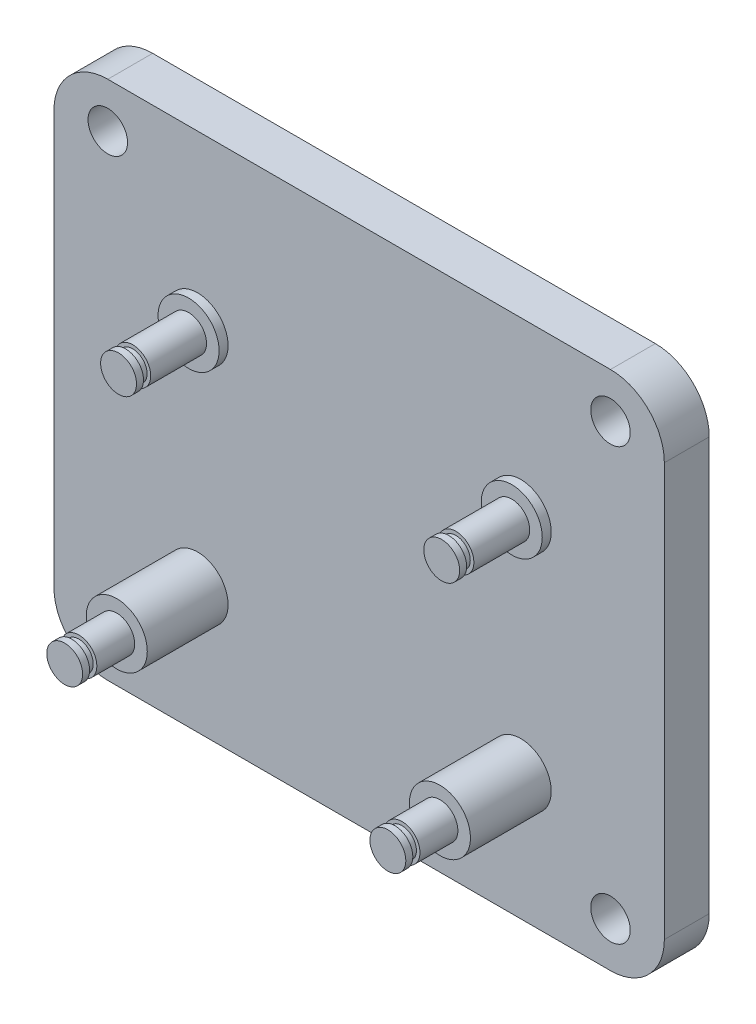
ISO-10303-21;
HEADER;
FILE_DESCRIPTION(('STEP AP214'),'2;1');
FILE_NAME('part.step','',(''),(''),'','','');
FILE_SCHEMA(('AUTOMOTIVE_DESIGN { 1 0 10303 214 1 1 1 1 }'));
ENDSEC;
DATA;
#1=APPLICATION_CONTEXT('core data for automotive mechanical design processes');
#2=APPLICATION_PROTOCOL_DEFINITION('international standard','automotive_design',2000,#1);
#3=PRODUCT_CONTEXT('',#1,'mechanical');
#4=PRODUCT('Part','Part','',(#3));
#5=PRODUCT_RELATED_PRODUCT_CATEGORY('part','',(#4));
#6=PRODUCT_DEFINITION_FORMATION('','',#4);
#7=PRODUCT_DEFINITION_CONTEXT('part definition',#1,'design');
#8=PRODUCT_DEFINITION('design','',#6,#7);
#9=PRODUCT_DEFINITION_SHAPE('','',#8);
#10=(LENGTH_UNIT() NAMED_UNIT(*) SI_UNIT(.MILLI.,.METRE.));
#11=(NAMED_UNIT(*) PLANE_ANGLE_UNIT() SI_UNIT($,.RADIAN.));
#12=(NAMED_UNIT(*) SI_UNIT($,.STERADIAN.) SOLID_ANGLE_UNIT());
#13=UNCERTAINTY_MEASURE_WITH_UNIT(LENGTH_MEASURE(1.E-05),#10,'distance_accuracy_value','');
#14=(GEOMETRIC_REPRESENTATION_CONTEXT(3) GLOBAL_UNCERTAINTY_ASSIGNED_CONTEXT((#13)) GLOBAL_UNIT_ASSIGNED_CONTEXT((#10,
#11,#12)) REPRESENTATION_CONTEXT('',''));
#15=CARTESIAN_POINT('',(0.,0.,0.));
#16=DIRECTION('',(0.,0.,1.));
#17=DIRECTION('',(1.,0.,0.));
#18=AXIS2_PLACEMENT_3D('',#15,#16,#17);
#19=CARTESIAN_POINT('',(18.,0.,13.8));
#20=DIRECTION('',(0.,0.,1.));
#21=DIRECTION('',(1.,0.,0.));
#22=AXIS2_PLACEMENT_3D('',#19,#20,#21);
#23=PLANE('',#22);
#24=CARTESIAN_POINT('',(18.,0.,13.8));
#25=DIRECTION('',(0.,0.,1.));
#26=DIRECTION('',(1.,0.,0.));
#27=AXIS2_PLACEMENT_3D('',#24,#25,#26);
#28=CIRCLE('',#27,2.);
#29=CARTESIAN_POINT('',(20.,0.,13.8));
#30=VERTEX_POINT('',#29);
#31=EDGE_CURVE('E9',#30,#30,#28,.T.);
#32=ORIENTED_EDGE('',*,*,#31,.T.);
#33=EDGE_LOOP('',(#32));
#34=FACE_BOUND('',#33,.T.);
#35=ADVANCED_FACE('F15',(#34),#23,.T.);
#36=CARTESIAN_POINT('',(-18.,0.,13.8));
#37=DIRECTION('',(0.,0.,1.));
#38=DIRECTION('',(1.,0.,0.));
#39=AXIS2_PLACEMENT_3D('',#36,#37,#38);
#40=PLANE('',#39);
#41=CARTESIAN_POINT('',(-18.,0.,13.8));
#42=DIRECTION('',(0.,0.,1.));
#43=DIRECTION('',(1.,0.,0.));
#44=AXIS2_PLACEMENT_3D('',#41,#42,#43);
#45=CIRCLE('',#44,2.);
#46=CARTESIAN_POINT('',(-16.,0.,13.8));
#47=VERTEX_POINT('',#46);
#48=EDGE_CURVE('E40',#47,#47,#45,.T.);
#49=ORIENTED_EDGE('',*,*,#48,.T.);
#50=EDGE_LOOP('',(#49));
#51=FACE_BOUND('',#50,.T.);
#52=ADVANCED_FACE('F17',(#51),#40,.T.);
#53=CARTESIAN_POINT('',(18.,-25.,19.8));
#54=DIRECTION('',(0.,0.,1.));
#55=DIRECTION('',(1.,0.,0.));
#56=AXIS2_PLACEMENT_3D('',#53,#54,#55);
#57=PLANE('',#56);
#58=CARTESIAN_POINT('',(18.,-25.,19.8));
#59=DIRECTION('',(0.,0.,1.));
#60=DIRECTION('',(1.,0.,0.));
#61=AXIS2_PLACEMENT_3D('',#58,#59,#60);
#62=CIRCLE('',#61,2.);
#63=CARTESIAN_POINT('',(20.,-25.,19.8));
#64=VERTEX_POINT('',#63);
#65=EDGE_CURVE('E463',#64,#64,#62,.T.);
#66=ORIENTED_EDGE('',*,*,#65,.T.);
#67=EDGE_LOOP('',(#66));
#68=FACE_BOUND('',#67,.T.);
#69=ADVANCED_FACE('F601',(#68),#57,.T.);
#70=CARTESIAN_POINT('',(-18.,-25.,19.8));
#71=DIRECTION('',(0.,0.,1.));
#72=DIRECTION('',(1.,0.,0.));
#73=AXIS2_PLACEMENT_3D('',#70,#71,#72);
#74=PLANE('',#73);
#75=CARTESIAN_POINT('',(-18.,-25.,19.8));
#76=DIRECTION('',(0.,0.,1.));
#77=DIRECTION('',(1.,0.,0.));
#78=AXIS2_PLACEMENT_3D('',#75,#76,#77);
#79=CIRCLE('',#78,2.);
#80=CARTESIAN_POINT('',(-16.,-25.,19.8));
#81=VERTEX_POINT('',#80);
#82=EDGE_CURVE('E350',#81,#81,#79,.T.);
#83=ORIENTED_EDGE('',*,*,#82,.T.);
#84=EDGE_LOOP('',(#83));
#85=FACE_BOUND('',#84,.T.);
#86=ADVANCED_FACE('F877',(#85),#74,.T.);
#87=CARTESIAN_POINT('',(18.,0.,0.));
#88=DIRECTION('',(0.,0.,-1.));
#89=DIRECTION('',(1.,0.,0.));
#90=AXIS2_PLACEMENT_3D('',#87,#88,#89);
#91=CYLINDRICAL_SURFACE('',#90,2.);
#92=DIRECTION('',(0.,0.,1.));
#93=VECTOR('',#92,1.);
#94=CARTESIAN_POINT('',(20.,0.,0.));
#95=LINE('',#94,#93);
#96=CARTESIAN_POINT('',(20.,0.,13.02));
#97=VERTEX_POINT('',#96);
#98=EDGE_CURVE('E19',#97,#30,#95,.T.);
#99=ORIENTED_EDGE('',*,*,#98,.T.);
#100=ORIENTED_EDGE('',*,*,#31,.F.);
#101=ORIENTED_EDGE('',*,*,#98,.F.);
#102=CARTESIAN_POINT('',(18.,0.,13.02));
#103=DIRECTION('',(0.,0.,-1.));
#104=DIRECTION('',(1.,0.,0.));
#105=AXIS2_PLACEMENT_3D('',#102,#103,#104);
#106=CIRCLE('',#105,2.);
#107=EDGE_CURVE('E351',#97,#97,#106,.T.);
#108=ORIENTED_EDGE('',*,*,#107,.F.);
#109=EDGE_LOOP('',(#99,#100,#101,#108));
#110=FACE_BOUND('',#109,.T.);
#111=ADVANCED_FACE('F873',(#110),#91,.T.);
#112=CARTESIAN_POINT('',(-18.,0.,0.));
#113=DIRECTION('',(0.,0.,-1.));
#114=DIRECTION('',(1.,0.,0.));
#115=AXIS2_PLACEMENT_3D('',#112,#113,#114);
#116=CYLINDRICAL_SURFACE('',#115,2.);
#117=DIRECTION('',(0.,0.,1.));
#118=VECTOR('',#117,1.);
#119=CARTESIAN_POINT('',(-16.,0.,0.));
#120=LINE('',#119,#118);
#121=CARTESIAN_POINT('',(-16.,0.,13.02));
#122=VERTEX_POINT('',#121);
#123=EDGE_CURVE('E466',#122,#47,#120,.T.);
#124=ORIENTED_EDGE('',*,*,#123,.T.);
#125=ORIENTED_EDGE('',*,*,#48,.F.);
#126=ORIENTED_EDGE('',*,*,#123,.F.);
#127=CARTESIAN_POINT('',(-18.,0.,13.02));
#128=DIRECTION('',(0.,0.,-1.));
#129=DIRECTION('',(1.,0.,0.));
#130=AXIS2_PLACEMENT_3D('',#127,#128,#129);
#131=CIRCLE('',#130,2.);
#132=EDGE_CURVE('E393',#122,#122,#131,.T.);
#133=ORIENTED_EDGE('',*,*,#132,.F.);
#134=EDGE_LOOP('',(#124,#125,#126,#133));
#135=FACE_BOUND('',#134,.T.);
#136=ADVANCED_FACE('F876',(#135),#116,.T.);
#137=CARTESIAN_POINT('',(18.,-25.,0.));
#138=DIRECTION('',(0.,0.,-1.));
#139=DIRECTION('',(1.,0.,0.));
#140=AXIS2_PLACEMENT_3D('',#137,#138,#139);
#141=CYLINDRICAL_SURFACE('',#140,2.);
#142=DIRECTION('',(0.,0.,1.));
#143=VECTOR('',#142,1.);
#144=CARTESIAN_POINT('',(20.,-25.,0.));
#145=LINE('',#144,#143);
#146=CARTESIAN_POINT('',(20.,-25.,19.02));
#147=VERTEX_POINT('',#146);
#148=EDGE_CURVE('E467',#147,#64,#145,.T.);
#149=ORIENTED_EDGE('',*,*,#148,.T.);
#150=ORIENTED_EDGE('',*,*,#65,.F.);
#151=ORIENTED_EDGE('',*,*,#148,.F.);
#152=CARTESIAN_POINT('',(18.,-25.,19.02));
#153=DIRECTION('',(0.,0.,-1.));
#154=DIRECTION('',(1.,0.,0.));
#155=AXIS2_PLACEMENT_3D('',#152,#153,#154);
#156=CIRCLE('',#155,2.);
#157=EDGE_CURVE('E397',#147,#147,#156,.T.);
#158=ORIENTED_EDGE('',*,*,#157,.F.);
#159=EDGE_LOOP('',(#149,#150,#151,#158));
#160=FACE_BOUND('',#159,.T.);
#161=ADVANCED_FACE('F576',(#160),#141,.T.);
#162=CARTESIAN_POINT('',(-18.,-25.,0.));
#163=DIRECTION('',(0.,0.,-1.));
#164=DIRECTION('',(1.,0.,0.));
#165=AXIS2_PLACEMENT_3D('',#162,#163,#164);
#166=CYLINDRICAL_SURFACE('',#165,2.);
#167=DIRECTION('',(0.,0.,1.));
#168=VECTOR('',#167,1.);
#169=CARTESIAN_POINT('',(-16.,-25.,0.));
#170=LINE('',#169,#168);
#171=CARTESIAN_POINT('',(-16.,-25.,19.02));
#172=VERTEX_POINT('',#171);
#173=EDGE_CURVE('E346',#172,#81,#170,.T.);
#174=ORIENTED_EDGE('',*,*,#173,.T.);
#175=ORIENTED_EDGE('',*,*,#82,.F.);
#176=ORIENTED_EDGE('',*,*,#173,.F.);
#177=CARTESIAN_POINT('',(-18.,-25.,19.02));
#178=DIRECTION('',(0.,0.,-1.));
#179=DIRECTION('',(1.,0.,0.));
#180=AXIS2_PLACEMENT_3D('',#177,#178,#179);
#181=CIRCLE('',#180,2.);
#182=EDGE_CURVE('E381',#172,#172,#181,.T.);
#183=ORIENTED_EDGE('',*,*,#182,.F.);
#184=EDGE_LOOP('',(#174,#175,#176,#183));
#185=FACE_BOUND('',#184,.T.);
#186=ADVANCED_FACE('F633',(#185),#166,.T.);
#187=CARTESIAN_POINT('',(18.,0.,13.02));
#188=DIRECTION('',(0.,0.,1.));
#189=DIRECTION('',(1.,0.,0.));
#190=AXIS2_PLACEMENT_3D('',#187,#188,#189);
#191=PLANE('',#190);
#192=CARTESIAN_POINT('',(18.,0.,13.02));
#193=DIRECTION('',(0.,0.,1.));
#194=DIRECTION('',(1.,0.,0.));
#195=AXIS2_PLACEMENT_3D('',#192,#193,#194);
#196=CIRCLE('',#195,1.6);
#197=CARTESIAN_POINT('',(19.6,0.,13.02));
#198=VERTEX_POINT('',#197);
#199=EDGE_CURVE('E378',#198,#198,#196,.T.);
#200=ORIENTED_EDGE('',*,*,#199,.T.);
#201=EDGE_LOOP('',(#200));
#202=FACE_BOUND('',#201,.T.);
#203=ORIENTED_EDGE('',*,*,#107,.T.);
#204=EDGE_LOOP('',(#203));
#205=FACE_BOUND('',#204,.T.);
#206=ADVANCED_FACE('F592',(#202,#205),#191,.F.);
#207=CARTESIAN_POINT('',(-18.,0.,13.02));
#208=DIRECTION('',(0.,0.,1.));
#209=DIRECTION('',(1.,0.,0.));
#210=AXIS2_PLACEMENT_3D('',#207,#208,#209);
#211=PLANE('',#210);
#212=CARTESIAN_POINT('',(-18.,0.,13.02));
#213=DIRECTION('',(0.,0.,1.));
#214=DIRECTION('',(1.,0.,0.));
#215=AXIS2_PLACEMENT_3D('',#212,#213,#214);
#216=CIRCLE('',#215,1.6);
#217=CARTESIAN_POINT('',(-16.4,0.,13.02));
#218=VERTEX_POINT('',#217);
#219=EDGE_CURVE('E477',#218,#218,#216,.T.);
#220=ORIENTED_EDGE('',*,*,#219,.T.);
#221=EDGE_LOOP('',(#220));
#222=FACE_BOUND('',#221,.T.);
#223=ORIENTED_EDGE('',*,*,#132,.T.);
#224=EDGE_LOOP('',(#223));
#225=FACE_BOUND('',#224,.T.);
#226=ADVANCED_FACE('F581',(#222,#225),#211,.F.);
#227=CARTESIAN_POINT('',(18.,-25.,19.02));
#228=DIRECTION('',(0.,0.,1.));
#229=DIRECTION('',(1.,0.,0.));
#230=AXIS2_PLACEMENT_3D('',#227,#228,#229);
#231=PLANE('',#230);
#232=CARTESIAN_POINT('',(18.,-25.,19.02));
#233=DIRECTION('',(0.,0.,1.));
#234=DIRECTION('',(1.,0.,0.));
#235=AXIS2_PLACEMENT_3D('',#232,#233,#234);
#236=CIRCLE('',#235,1.6);
#237=CARTESIAN_POINT('',(19.6,-25.,19.02));
#238=VERTEX_POINT('',#237);
#239=EDGE_CURVE('E550',#238,#238,#236,.T.);
#240=ORIENTED_EDGE('',*,*,#239,.T.);
#241=EDGE_LOOP('',(#240));
#242=FACE_BOUND('',#241,.T.);
#243=ORIENTED_EDGE('',*,*,#157,.T.);
#244=EDGE_LOOP('',(#243));
#245=FACE_BOUND('',#244,.T.);
#246=ADVANCED_FACE('F578',(#242,#245),#231,.F.);
#247=CARTESIAN_POINT('',(-18.,-25.,19.02));
#248=DIRECTION('',(0.,0.,1.));
#249=DIRECTION('',(1.,0.,0.));
#250=AXIS2_PLACEMENT_3D('',#247,#248,#249);
#251=PLANE('',#250);
#252=CARTESIAN_POINT('',(-18.,-25.,19.02));
#253=DIRECTION('',(0.,0.,1.));
#254=DIRECTION('',(1.,0.,0.));
#255=AXIS2_PLACEMENT_3D('',#252,#253,#254);
#256=CIRCLE('',#255,1.6);
#257=CARTESIAN_POINT('',(-16.4,-25.,19.02));
#258=VERTEX_POINT('',#257);
#259=EDGE_CURVE('E337',#258,#258,#256,.T.);
#260=ORIENTED_EDGE('',*,*,#259,.T.);
#261=EDGE_LOOP('',(#260));
#262=FACE_BOUND('',#261,.T.);
#263=ORIENTED_EDGE('',*,*,#182,.T.);
#264=EDGE_LOOP('',(#263));
#265=FACE_BOUND('',#264,.T.);
#266=ADVANCED_FACE('F580',(#262,#265),#251,.F.);
#267=CARTESIAN_POINT('',(18.,0.,12.22));
#268=DIRECTION('',(0.,0.,-1.));
#269=DIRECTION('',(1.,0.,0.));
#270=AXIS2_PLACEMENT_3D('',#267,#268,#269);
#271=CYLINDRICAL_SURFACE('',#270,1.6);
#272=CARTESIAN_POINT('',(18.,0.,12.22));
#273=DIRECTION('',(0.,0.,1.));
#274=DIRECTION('',(1.,0.,0.));
#275=AXIS2_PLACEMENT_3D('',#272,#273,#274);
#276=CIRCLE('',#275,1.6);
#277=CARTESIAN_POINT('',(19.6,0.,12.22));
#278=VERTEX_POINT('',#277);
#279=EDGE_CURVE('E423',#278,#278,#276,.T.);
#280=ORIENTED_EDGE('',*,*,#279,.T.);
#281=DIRECTION('',(0.,0.,1.));
#282=VECTOR('',#281,1.);
#283=CARTESIAN_POINT('',(19.6,0.,12.22));
#284=LINE('',#283,#282);
#285=EDGE_CURVE('E382',#278,#198,#284,.T.);
#286=ORIENTED_EDGE('',*,*,#285,.T.);
#287=ORIENTED_EDGE('',*,*,#199,.F.);
#288=ORIENTED_EDGE('',*,*,#285,.F.);
#289=EDGE_LOOP('',(#280,#286,#287,#288));
#290=FACE_BOUND('',#289,.T.);
#291=ADVANCED_FACE('F589',(#290),#271,.T.);
#292=CARTESIAN_POINT('',(-18.,0.,12.22));
#293=DIRECTION('',(0.,0.,-1.));
#294=DIRECTION('',(1.,0.,0.));
#295=AXIS2_PLACEMENT_3D('',#292,#293,#294);
#296=CYLINDRICAL_SURFACE('',#295,1.6);
#297=CARTESIAN_POINT('',(-18.,0.,12.22));
#298=DIRECTION('',(0.,0.,1.));
#299=DIRECTION('',(1.,0.,0.));
#300=AXIS2_PLACEMENT_3D('',#297,#298,#299);
#301=CIRCLE('',#300,1.6);
#302=CARTESIAN_POINT('',(-16.4,0.,12.22));
#303=VERTEX_POINT('',#302);
#304=EDGE_CURVE('E528',#303,#303,#301,.T.);
#305=ORIENTED_EDGE('',*,*,#304,.T.);
#306=DIRECTION('',(0.,0.,1.));
#307=VECTOR('',#306,1.);
#308=CARTESIAN_POINT('',(-16.4,0.,12.22));
#309=LINE('',#308,#307);
#310=EDGE_CURVE('E553',#303,#218,#309,.T.);
#311=ORIENTED_EDGE('',*,*,#310,.T.);
#312=ORIENTED_EDGE('',*,*,#219,.F.);
#313=ORIENTED_EDGE('',*,*,#310,.F.);
#314=EDGE_LOOP('',(#305,#311,#312,#313));
#315=FACE_BOUND('',#314,.T.);
#316=ADVANCED_FACE('F619',(#315),#296,.T.);
#317=CARTESIAN_POINT('',(18.,-25.,18.22));
#318=DIRECTION('',(0.,0.,-1.));
#319=DIRECTION('',(1.,0.,0.));
#320=AXIS2_PLACEMENT_3D('',#317,#318,#319);
#321=CYLINDRICAL_SURFACE('',#320,1.6);
#322=CARTESIAN_POINT('',(18.,-25.,18.22));
#323=DIRECTION('',(0.,0.,1.));
#324=DIRECTION('',(1.,0.,0.));
#325=AXIS2_PLACEMENT_3D('',#322,#323,#324);
#326=CIRCLE('',#325,1.6);
#327=CARTESIAN_POINT('',(19.6,-25.,18.22));
#328=VERTEX_POINT('',#327);
#329=EDGE_CURVE('E540',#328,#328,#326,.T.);
#330=ORIENTED_EDGE('',*,*,#329,.T.);
#331=DIRECTION('',(0.,0.,1.));
#332=VECTOR('',#331,1.);
#333=CARTESIAN_POINT('',(19.6,-25.,18.22));
#334=LINE('',#333,#332);
#335=EDGE_CURVE('E340',#328,#238,#334,.T.);
#336=ORIENTED_EDGE('',*,*,#335,.T.);
#337=ORIENTED_EDGE('',*,*,#239,.F.);
#338=ORIENTED_EDGE('',*,*,#335,.F.);
#339=EDGE_LOOP('',(#330,#336,#337,#338));
#340=FACE_BOUND('',#339,.T.);
#341=ADVANCED_FACE('F615',(#340),#321,.T.);
#342=CARTESIAN_POINT('',(-18.,-25.,18.22));
#343=DIRECTION('',(0.,0.,-1.));
#344=DIRECTION('',(1.,0.,0.));
#345=AXIS2_PLACEMENT_3D('',#342,#343,#344);
#346=CYLINDRICAL_SURFACE('',#345,1.6);
#347=CARTESIAN_POINT('',(-18.,-25.,18.22));
#348=DIRECTION('',(0.,0.,1.));
#349=DIRECTION('',(1.,0.,0.));
#350=AXIS2_PLACEMENT_3D('',#347,#348,#349);
#351=CIRCLE('',#350,1.6);
#352=CARTESIAN_POINT('',(-16.4,-25.,18.22));
#353=VERTEX_POINT('',#352);
#354=EDGE_CURVE('E536',#353,#353,#351,.T.);
#355=ORIENTED_EDGE('',*,*,#354,.T.);
#356=DIRECTION('',(0.,0.,1.));
#357=VECTOR('',#356,1.);
#358=CARTESIAN_POINT('',(-16.4,-25.,18.22));
#359=LINE('',#358,#357);
#360=EDGE_CURVE('E341',#353,#258,#359,.T.);
#361=ORIENTED_EDGE('',*,*,#360,.T.);
#362=ORIENTED_EDGE('',*,*,#259,.F.);
#363=ORIENTED_EDGE('',*,*,#360,.F.);
#364=EDGE_LOOP('',(#355,#361,#362,#363));
#365=FACE_BOUND('',#364,.T.);
#366=ADVANCED_FACE('F618',(#365),#346,.T.);
#367=CARTESIAN_POINT('',(18.,0.,12.22));
#368=DIRECTION('',(0.,0.,1.));
#369=DIRECTION('',(1.,0.,0.));
#370=AXIS2_PLACEMENT_3D('',#367,#368,#369);
#371=PLANE('',#370);
#372=ORIENTED_EDGE('',*,*,#279,.F.);
#373=EDGE_LOOP('',(#372));
#374=FACE_BOUND('',#373,.T.);
#375=CARTESIAN_POINT('',(18.,0.,12.22));
#376=DIRECTION('',(0.,0.,-1.));
#377=DIRECTION('',(1.,0.,0.));
#378=AXIS2_PLACEMENT_3D('',#375,#376,#377);
#379=CIRCLE('',#378,2.);
#380=CARTESIAN_POINT('',(20.,0.,12.22));
#381=VERTEX_POINT('',#380);
#382=EDGE_CURVE('E428',#381,#381,#379,.T.);
#383=ORIENTED_EDGE('',*,*,#382,.F.);
#384=EDGE_LOOP('',(#383));
#385=FACE_BOUND('',#384,.T.);
#386=ADVANCED_FACE('F639',(#374,#385),#371,.T.);
#387=CARTESIAN_POINT('',(-18.,0.,12.22));
#388=DIRECTION('',(0.,0.,1.));
#389=DIRECTION('',(1.,0.,0.));
#390=AXIS2_PLACEMENT_3D('',#387,#388,#389);
#391=PLANE('',#390);
#392=ORIENTED_EDGE('',*,*,#304,.F.);
#393=EDGE_LOOP('',(#392));
#394=FACE_BOUND('',#393,.T.);
#395=CARTESIAN_POINT('',(-18.,0.,12.22));
#396=DIRECTION('',(0.,0.,-1.));
#397=DIRECTION('',(1.,0.,0.));
#398=AXIS2_PLACEMENT_3D('',#395,#396,#397);
#399=CIRCLE('',#398,2.);
#400=CARTESIAN_POINT('',(-16.,0.,12.22));
#401=VERTEX_POINT('',#400);
#402=EDGE_CURVE('E504',#401,#401,#399,.T.);
#403=ORIENTED_EDGE('',*,*,#402,.F.);
#404=EDGE_LOOP('',(#403));
#405=FACE_BOUND('',#404,.T.);
#406=ADVANCED_FACE('F635',(#394,#405),#391,.T.);
#407=CARTESIAN_POINT('',(18.,-25.,18.22));
#408=DIRECTION('',(0.,0.,1.));
#409=DIRECTION('',(1.,0.,0.));
#410=AXIS2_PLACEMENT_3D('',#407,#408,#409);
#411=PLANE('',#410);
#412=ORIENTED_EDGE('',*,*,#329,.F.);
#413=EDGE_LOOP('',(#412));
#414=FACE_BOUND('',#413,.T.);
#415=CARTESIAN_POINT('',(18.,-25.,18.22));
#416=DIRECTION('',(0.,0.,-1.));
#417=DIRECTION('',(1.,0.,0.));
#418=AXIS2_PLACEMENT_3D('',#415,#416,#417);
#419=CIRCLE('',#418,2.);
#420=CARTESIAN_POINT('',(20.,-25.,18.22));
#421=VERTEX_POINT('',#420);
#422=EDGE_CURVE('E520',#421,#421,#419,.T.);
#423=ORIENTED_EDGE('',*,*,#422,.F.);
#424=EDGE_LOOP('',(#423));
#425=FACE_BOUND('',#424,.T.);
#426=ADVANCED_FACE('F638',(#414,#425),#411,.T.);
#427=CARTESIAN_POINT('',(-18.,-25.,18.22));
#428=DIRECTION('',(0.,0.,1.));
#429=DIRECTION('',(1.,0.,0.));
#430=AXIS2_PLACEMENT_3D('',#427,#428,#429);
#431=PLANE('',#430);
#432=ORIENTED_EDGE('',*,*,#354,.F.);
#433=EDGE_LOOP('',(#432));
#434=FACE_BOUND('',#433,.T.);
#435=CARTESIAN_POINT('',(-18.,-25.,18.22));
#436=DIRECTION('',(0.,0.,-1.));
#437=DIRECTION('',(1.,0.,0.));
#438=AXIS2_PLACEMENT_3D('',#435,#436,#437);
#439=CIRCLE('',#438,2.);
#440=CARTESIAN_POINT('',(-16.,-25.,18.22));
#441=VERTEX_POINT('',#440);
#442=EDGE_CURVE('E495',#441,#441,#439,.T.);
#443=ORIENTED_EDGE('',*,*,#442,.F.);
#444=EDGE_LOOP('',(#443));
#445=FACE_BOUND('',#444,.T.);
#446=ADVANCED_FACE('F625',(#434,#445),#431,.T.);
#447=CARTESIAN_POINT('',(18.,0.,0.));
#448=DIRECTION('',(0.,0.,-1.));
#449=DIRECTION('',(1.,0.,0.));
#450=AXIS2_PLACEMENT_3D('',#447,#448,#449);
#451=CYLINDRICAL_SURFACE('',#450,2.);
#452=ORIENTED_EDGE('',*,*,#382,.T.);
#453=DIRECTION('',(0.,0.,1.));
#454=VECTOR('',#453,1.);
#455=CARTESIAN_POINT('',(20.,0.,0.));
#456=LINE('',#455,#454);
#457=CARTESIAN_POINT('',(20.,0.,6.));
#458=VERTEX_POINT('',#457);
#459=EDGE_CURVE('E432',#458,#381,#456,.T.);
#460=ORIENTED_EDGE('',*,*,#459,.F.);
#461=CARTESIAN_POINT('',(18.,0.,6.));
#462=DIRECTION('',(0.,0.,-1.));
#463=DIRECTION('',(1.,0.,0.));
#464=AXIS2_PLACEMENT_3D('',#461,#462,#463);
#465=CIRCLE('',#464,2.);
#466=EDGE_CURVE('E451',#458,#458,#465,.T.);
#467=ORIENTED_EDGE('',*,*,#466,.F.);
#468=ORIENTED_EDGE('',*,*,#459,.T.);
#469=EDGE_LOOP('',(#452,#460,#467,#468));
#470=FACE_BOUND('',#469,.T.);
#471=ADVANCED_FACE('F621',(#470),#451,.T.);
#472=CARTESIAN_POINT('',(-18.,0.,0.));
#473=DIRECTION('',(0.,0.,-1.));
#474=DIRECTION('',(1.,0.,0.));
#475=AXIS2_PLACEMENT_3D('',#472,#473,#474);
#476=CYLINDRICAL_SURFACE('',#475,2.);
#477=ORIENTED_EDGE('',*,*,#402,.T.);
#478=DIRECTION('',(0.,0.,1.));
#479=VECTOR('',#478,1.);
#480=CARTESIAN_POINT('',(-16.,0.,0.));
#481=LINE('',#480,#479);
#482=CARTESIAN_POINT('',(-16.,0.,6.));
#483=VERTEX_POINT('',#482);
#484=EDGE_CURVE('E433',#483,#401,#481,.T.);
#485=ORIENTED_EDGE('',*,*,#484,.F.);
#486=CARTESIAN_POINT('',(-18.,0.,6.));
#487=DIRECTION('',(0.,0.,-1.));
#488=DIRECTION('',(1.,0.,0.));
#489=AXIS2_PLACEMENT_3D('',#486,#487,#488);
#490=CIRCLE('',#489,2.);
#491=EDGE_CURVE('E447',#483,#483,#490,.T.);
#492=ORIENTED_EDGE('',*,*,#491,.F.);
#493=ORIENTED_EDGE('',*,*,#484,.T.);
#494=EDGE_LOOP('',(#477,#485,#492,#493));
#495=FACE_BOUND('',#494,.T.);
#496=ADVANCED_FACE('F624',(#495),#476,.T.);
#497=CARTESIAN_POINT('',(18.,-25.,0.));
#498=DIRECTION('',(0.,0.,-1.));
#499=DIRECTION('',(1.,0.,0.));
#500=AXIS2_PLACEMENT_3D('',#497,#498,#499);
#501=CYLINDRICAL_SURFACE('',#500,2.);
#502=ORIENTED_EDGE('',*,*,#422,.T.);
#503=DIRECTION('',(0.,0.,1.));
#504=VECTOR('',#503,1.);
#505=CARTESIAN_POINT('',(20.,-25.,0.));
#506=LINE('',#505,#504);
#507=CARTESIAN_POINT('',(20.,-25.,14.));
#508=VERTEX_POINT('',#507);
#509=EDGE_CURVE('E524',#508,#421,#506,.T.);
#510=ORIENTED_EDGE('',*,*,#509,.F.);
#511=CARTESIAN_POINT('',(18.,-25.,14.));
#512=DIRECTION('',(0.,0.,-1.));
#513=DIRECTION('',(1.,0.,0.));
#514=AXIS2_PLACEMENT_3D('',#511,#512,#513);
#515=CIRCLE('',#514,2.);
#516=EDGE_CURVE('E452',#508,#508,#515,.T.);
#517=ORIENTED_EDGE('',*,*,#516,.F.);
#518=ORIENTED_EDGE('',*,*,#509,.T.);
#519=EDGE_LOOP('',(#502,#510,#517,#518));
#520=FACE_BOUND('',#519,.T.);
#521=ADVANCED_FACE('F702',(#520),#501,.T.);
#522=CARTESIAN_POINT('',(-18.,-25.,0.));
#523=DIRECTION('',(0.,0.,-1.));
#524=DIRECTION('',(1.,0.,0.));
#525=AXIS2_PLACEMENT_3D('',#522,#523,#524);
#526=CYLINDRICAL_SURFACE('',#525,2.);
#527=ORIENTED_EDGE('',*,*,#442,.T.);
#528=DIRECTION('',(0.,0.,1.));
#529=VECTOR('',#528,1.);
#530=CARTESIAN_POINT('',(-16.,-25.,0.));
#531=LINE('',#530,#529);
#532=CARTESIAN_POINT('',(-16.,-25.,14.));
#533=VERTEX_POINT('',#532);
#534=EDGE_CURVE('E499',#533,#441,#531,.T.);
#535=ORIENTED_EDGE('',*,*,#534,.F.);
#536=CARTESIAN_POINT('',(-18.,-25.,14.));
#537=DIRECTION('',(0.,0.,-1.));
#538=DIRECTION('',(1.,0.,0.));
#539=AXIS2_PLACEMENT_3D('',#536,#537,#538);
#540=CIRCLE('',#539,2.);
#541=EDGE_CURVE('E300',#533,#533,#540,.T.);
#542=ORIENTED_EDGE('',*,*,#541,.F.);
#543=ORIENTED_EDGE('',*,*,#534,.T.);
#544=EDGE_LOOP('',(#527,#535,#542,#543));
#545=FACE_BOUND('',#544,.T.);
#546=ADVANCED_FACE('F698',(#545),#526,.T.);
#547=CARTESIAN_POINT('',(18.,0.,6.));
#548=DIRECTION('',(0.,0.,1.));
#549=DIRECTION('',(1.,0.,0.));
#550=AXIS2_PLACEMENT_3D('',#547,#548,#549);
#551=PLANE('',#550);
#552=ORIENTED_EDGE('',*,*,#466,.T.);
#553=EDGE_LOOP('',(#552));
#554=FACE_BOUND('',#553,.T.);
#555=CARTESIAN_POINT('',(18.,0.,6.));
#556=DIRECTION('',(0.,0.,1.));
#557=DIRECTION('',(1.,0.,0.));
#558=AXIS2_PLACEMENT_3D('',#555,#556,#557);
#559=CIRCLE('',#558,3.4);
#560=CARTESIAN_POINT('',(21.4,0.,6.));
#561=VERTEX_POINT('',#560);
#562=EDGE_CURVE('E453',#561,#561,#559,.T.);
#563=ORIENTED_EDGE('',*,*,#562,.T.);
#564=EDGE_LOOP('',(#563));
#565=FACE_BOUND('',#564,.T.);
#566=ADVANCED_FACE('F701',(#554,#565),#551,.T.);
#567=CARTESIAN_POINT('',(-18.,0.,6.));
#568=DIRECTION('',(0.,0.,1.));
#569=DIRECTION('',(1.,0.,0.));
#570=AXIS2_PLACEMENT_3D('',#567,#568,#569);
#571=PLANE('',#570);
#572=ORIENTED_EDGE('',*,*,#491,.T.);
#573=EDGE_LOOP('',(#572));
#574=FACE_BOUND('',#573,.T.);
#575=CARTESIAN_POINT('',(-18.,0.,6.));
#576=DIRECTION('',(0.,0.,1.));
#577=DIRECTION('',(1.,0.,0.));
#578=AXIS2_PLACEMENT_3D('',#575,#576,#577);
#579=CIRCLE('',#578,3.4);
#580=CARTESIAN_POINT('',(-14.6,0.,6.));
#581=VERTEX_POINT('',#580);
#582=EDGE_CURVE('E309',#581,#581,#579,.T.);
#583=ORIENTED_EDGE('',*,*,#582,.T.);
#584=EDGE_LOOP('',(#583));
#585=FACE_BOUND('',#584,.T.);
#586=ADVANCED_FACE('F696',(#574,#585),#571,.T.);
#587=CARTESIAN_POINT('',(18.,-25.,14.));
#588=DIRECTION('',(0.,0.,1.));
#589=DIRECTION('',(1.,0.,0.));
#590=AXIS2_PLACEMENT_3D('',#587,#588,#589);
#591=PLANE('',#590);
#592=ORIENTED_EDGE('',*,*,#516,.T.);
#593=EDGE_LOOP('',(#592));
#594=FACE_BOUND('',#593,.T.);
#595=CARTESIAN_POINT('',(18.,-25.,14.));
#596=DIRECTION('',(0.,0.,1.));
#597=DIRECTION('',(1.,0.,0.));
#598=AXIS2_PLACEMENT_3D('',#595,#596,#597);
#599=CIRCLE('',#598,3.4);
#600=CARTESIAN_POINT('',(21.4,-25.,14.));
#601=VERTEX_POINT('',#600);
#602=EDGE_CURVE('E310',#601,#601,#599,.T.);
#603=ORIENTED_EDGE('',*,*,#602,.T.);
#604=EDGE_LOOP('',(#603));
#605=FACE_BOUND('',#604,.T.);
#606=ADVANCED_FACE('F692',(#594,#605),#591,.T.);
#607=CARTESIAN_POINT('',(-18.,-25.,14.));
#608=DIRECTION('',(0.,0.,1.));
#609=DIRECTION('',(1.,0.,0.));
#610=AXIS2_PLACEMENT_3D('',#607,#608,#609);
#611=PLANE('',#610);
#612=ORIENTED_EDGE('',*,*,#541,.T.);
#613=EDGE_LOOP('',(#612));
#614=FACE_BOUND('',#613,.T.);
#615=CARTESIAN_POINT('',(-18.,-25.,14.));
#616=DIRECTION('',(0.,0.,1.));
#617=DIRECTION('',(1.,0.,0.));
#618=AXIS2_PLACEMENT_3D('',#615,#616,#617);
#619=CIRCLE('',#618,3.4);
#620=CARTESIAN_POINT('',(-14.6,-25.,14.));
#621=VERTEX_POINT('',#620);
#622=EDGE_CURVE('E320',#621,#621,#619,.T.);
#623=ORIENTED_EDGE('',*,*,#622,.T.);
#624=EDGE_LOOP('',(#623));
#625=FACE_BOUND('',#624,.T.);
#626=ADVANCED_FACE('F688',(#614,#625),#611,.T.);
#627=CARTESIAN_POINT('',(18.,0.,0.));
#628=DIRECTION('',(0.,0.,-1.));
#629=DIRECTION('',(1.,0.,0.));
#630=AXIS2_PLACEMENT_3D('',#627,#628,#629);
#631=CYLINDRICAL_SURFACE('',#630,3.4);
#632=DIRECTION('',(0.,0.,1.));
#633=VECTOR('',#632,1.);
#634=CARTESIAN_POINT('',(21.4,0.,0.));
#635=LINE('',#634,#633);
#636=CARTESIAN_POINT('',(21.4,0.,5.));
#637=VERTEX_POINT('',#636);
#638=EDGE_CURVE('E456',#637,#561,#635,.T.);
#639=ORIENTED_EDGE('',*,*,#638,.T.);
#640=ORIENTED_EDGE('',*,*,#562,.F.);
#641=ORIENTED_EDGE('',*,*,#638,.F.);
#642=CARTESIAN_POINT('',(18.,0.,5.));
#643=DIRECTION('',(0.,0.,-1.));
#644=DIRECTION('',(1.,0.,0.));
#645=AXIS2_PLACEMENT_3D('',#642,#643,#644);
#646=CIRCLE('',#645,3.4);
#647=EDGE_CURVE('E410',#637,#637,#646,.T.);
#648=ORIENTED_EDGE('',*,*,#647,.F.);
#649=EDGE_LOOP('',(#639,#640,#641,#648));
#650=FACE_BOUND('',#649,.T.);
#651=ADVANCED_FACE('F681',(#650),#631,.T.);
#652=CARTESIAN_POINT('',(-18.,0.,0.));
#653=DIRECTION('',(0.,0.,-1.));
#654=DIRECTION('',(1.,0.,0.));
#655=AXIS2_PLACEMENT_3D('',#652,#653,#654);
#656=CYLINDRICAL_SURFACE('',#655,3.4);
#657=DIRECTION('',(0.,0.,1.));
#658=VECTOR('',#657,1.);
#659=CARTESIAN_POINT('',(-14.6,0.,0.));
#660=LINE('',#659,#658);
#661=CARTESIAN_POINT('',(-14.6,0.,5.));
#662=VERTEX_POINT('',#661);
#663=EDGE_CURVE('E305',#662,#581,#660,.T.);
#664=ORIENTED_EDGE('',*,*,#663,.T.);
#665=ORIENTED_EDGE('',*,*,#582,.F.);
#666=ORIENTED_EDGE('',*,*,#663,.F.);
#667=CARTESIAN_POINT('',(-18.,0.,5.));
#668=DIRECTION('',(0.,0.,-1.));
#669=DIRECTION('',(1.,0.,0.));
#670=AXIS2_PLACEMENT_3D('',#667,#668,#669);
#671=CIRCLE('',#670,3.4);
#672=EDGE_CURVE('E427',#662,#662,#671,.T.);
#673=ORIENTED_EDGE('',*,*,#672,.F.);
#674=EDGE_LOOP('',(#664,#665,#666,#673));
#675=FACE_BOUND('',#674,.T.);
#676=ADVANCED_FACE('F678',(#675),#656,.T.);
#677=CARTESIAN_POINT('',(18.,-25.,0.));
#678=DIRECTION('',(0.,0.,-1.));
#679=DIRECTION('',(1.,0.,0.));
#680=AXIS2_PLACEMENT_3D('',#677,#678,#679);
#681=CYLINDRICAL_SURFACE('',#680,3.4);
#682=DIRECTION('',(0.,0.,1.));
#683=VECTOR('',#682,1.);
#684=CARTESIAN_POINT('',(21.4,-25.,0.));
#685=LINE('',#684,#683);
#686=CARTESIAN_POINT('',(21.4,-25.,5.));
#687=VERTEX_POINT('',#686);
#688=EDGE_CURVE('E316',#687,#601,#685,.T.);
#689=ORIENTED_EDGE('',*,*,#688,.T.);
#690=ORIENTED_EDGE('',*,*,#602,.F.);
#691=ORIENTED_EDGE('',*,*,#688,.F.);
#692=CARTESIAN_POINT('',(18.,-25.,5.));
#693=DIRECTION('',(0.,0.,-1.));
#694=DIRECTION('',(1.,0.,0.));
#695=AXIS2_PLACEMENT_3D('',#692,#693,#694);
#696=CIRCLE('',#695,3.4);
#697=EDGE_CURVE('E389',#687,#687,#696,.T.);
#698=ORIENTED_EDGE('',*,*,#697,.F.);
#699=EDGE_LOOP('',(#689,#690,#691,#698));
#700=FACE_BOUND('',#699,.T.);
#701=ADVANCED_FACE('F661',(#700),#681,.T.);
#702=CARTESIAN_POINT('',(-18.,-25.,0.));
#703=DIRECTION('',(0.,0.,-1.));
#704=DIRECTION('',(1.,0.,0.));
#705=AXIS2_PLACEMENT_3D('',#702,#703,#704);
#706=CYLINDRICAL_SURFACE('',#705,3.4);
#707=DIRECTION('',(0.,0.,1.));
#708=VECTOR('',#707,1.);
#709=CARTESIAN_POINT('',(-14.6,-25.,0.));
#710=LINE('',#709,#708);
#711=CARTESIAN_POINT('',(-14.6,-25.,5.));
#712=VERTEX_POINT('',#711);
#713=EDGE_CURVE('E491',#712,#621,#710,.T.);
#714=ORIENTED_EDGE('',*,*,#713,.T.);
#715=ORIENTED_EDGE('',*,*,#622,.F.);
#716=ORIENTED_EDGE('',*,*,#713,.F.);
#717=CARTESIAN_POINT('',(-18.,-25.,5.));
#718=DIRECTION('',(0.,0.,-1.));
#719=DIRECTION('',(1.,0.,0.));
#720=AXIS2_PLACEMENT_3D('',#717,#718,#719);
#721=CIRCLE('',#720,3.4);
#722=EDGE_CURVE('E390',#712,#712,#721,.T.);
#723=ORIENTED_EDGE('',*,*,#722,.F.);
#724=EDGE_LOOP('',(#714,#715,#716,#723));
#725=FACE_BOUND('',#724,.T.);
#726=ADVANCED_FACE('F657',(#725),#706,.T.);
#727=CARTESIAN_POINT('',(28.,14.,0.));
#728=DIRECTION('',(0.,0.,-1.));
#729=DIRECTION('',(1.,0.,0.));
#730=AXIS2_PLACEMENT_3D('',#727,#728,#729);
#731=CYLINDRICAL_SURFACE('',#730,2.2);
#732=DIRECTION('',(0.,0.,1.));
#733=VECTOR('',#732,1.);
#734=CARTESIAN_POINT('',(30.2,14.,0.));
#735=LINE('',#734,#733);
#736=CARTESIAN_POINT('',(30.2,14.,0.));
#737=VERTEX_POINT('',#736);
#738=CARTESIAN_POINT('',(30.2,14.,5.));
#739=VERTEX_POINT('',#738);
#740=EDGE_CURVE('E486',#737,#739,#735,.T.);
#741=ORIENTED_EDGE('',*,*,#740,.T.);
#742=CARTESIAN_POINT('',(28.,14.,5.));
#743=DIRECTION('',(0.,0.,1.));
#744=DIRECTION('',(1.,0.,0.));
#745=AXIS2_PLACEMENT_3D('',#742,#743,#744);
#746=CIRCLE('',#745,2.2);
#747=EDGE_CURVE('E405',#739,#739,#746,.T.);
#748=ORIENTED_EDGE('',*,*,#747,.T.);
#749=ORIENTED_EDGE('',*,*,#740,.F.);
#750=CARTESIAN_POINT('',(28.,14.,0.));
#751=DIRECTION('',(0.,0.,1.));
#752=DIRECTION('',(1.,0.,0.));
#753=AXIS2_PLACEMENT_3D('',#750,#751,#752);
#754=CIRCLE('',#753,2.2);
#755=EDGE_CURVE('E326',#737,#737,#754,.T.);
#756=ORIENTED_EDGE('',*,*,#755,.F.);
#757=EDGE_LOOP('',(#741,#748,#749,#756));
#758=FACE_BOUND('',#757,.T.);
#759=ADVANCED_FACE('F660',(#758),#731,.F.);
#760=CARTESIAN_POINT('',(-28.,14.,0.));
#761=DIRECTION('',(0.,0.,-1.));
#762=DIRECTION('',(1.,0.,0.));
#763=AXIS2_PLACEMENT_3D('',#760,#761,#762);
#764=CYLINDRICAL_SURFACE('',#763,2.2);
#765=DIRECTION('',(0.,0.,1.));
#766=VECTOR('',#765,1.);
#767=CARTESIAN_POINT('',(-25.8,14.,0.));
#768=LINE('',#767,#766);
#769=CARTESIAN_POINT('',(-25.8,14.,0.));
#770=VERTEX_POINT('',#769);
#771=CARTESIAN_POINT('',(-25.8,14.,5.));
#772=VERTEX_POINT('',#771);
#773=EDGE_CURVE('E480',#770,#772,#768,.T.);
#774=ORIENTED_EDGE('',*,*,#773,.T.);
#775=CARTESIAN_POINT('',(-28.,14.,5.));
#776=DIRECTION('',(0.,0.,1.));
#777=DIRECTION('',(1.,0.,0.));
#778=AXIS2_PLACEMENT_3D('',#775,#776,#777);
#779=CIRCLE('',#778,2.2);
#780=EDGE_CURVE('E440',#772,#772,#779,.T.);
#781=ORIENTED_EDGE('',*,*,#780,.T.);
#782=ORIENTED_EDGE('',*,*,#773,.F.);
#783=CARTESIAN_POINT('',(-28.,14.,0.));
#784=DIRECTION('',(0.,0.,1.));
#785=DIRECTION('',(1.,0.,0.));
#786=AXIS2_PLACEMENT_3D('',#783,#784,#785);
#787=CIRCLE('',#786,2.2);
#788=EDGE_CURVE('E345',#770,#770,#787,.T.);
#789=ORIENTED_EDGE('',*,*,#788,.F.);
#790=EDGE_LOOP('',(#774,#781,#782,#789));
#791=FACE_BOUND('',#790,.T.);
#792=ADVANCED_FACE('F648',(#791),#764,.F.);
#793=CARTESIAN_POINT('',(28.,-34.,0.));
#794=DIRECTION('',(0.,0.,-1.));
#795=DIRECTION('',(1.,0.,0.));
#796=AXIS2_PLACEMENT_3D('',#793,#794,#795);
#797=CYLINDRICAL_SURFACE('',#796,2.2);
#798=DIRECTION('',(0.,0.,1.));
#799=VECTOR('',#798,1.);
#800=CARTESIAN_POINT('',(30.2,-34.,0.));
#801=LINE('',#800,#799);
#802=CARTESIAN_POINT('',(30.2,-34.,0.));
#803=VERTEX_POINT('',#802);
#804=CARTESIAN_POINT('',(30.2,-34.,5.));
#805=VERTEX_POINT('',#804);
#806=EDGE_CURVE('E473',#803,#805,#801,.T.);
#807=ORIENTED_EDGE('',*,*,#806,.T.);
#808=CARTESIAN_POINT('',(28.,-34.,5.));
#809=DIRECTION('',(0.,0.,1.));
#810=DIRECTION('',(1.,0.,0.));
#811=AXIS2_PLACEMENT_3D('',#808,#809,#810);
#812=CIRCLE('',#811,2.2);
#813=EDGE_CURVE('E385',#805,#805,#812,.T.);
#814=ORIENTED_EDGE('',*,*,#813,.T.);
#815=ORIENTED_EDGE('',*,*,#806,.F.);
#816=CARTESIAN_POINT('',(28.,-34.,0.));
#817=DIRECTION('',(0.,0.,1.));
#818=DIRECTION('',(1.,0.,0.));
#819=AXIS2_PLACEMENT_3D('',#816,#817,#818);
#820=CIRCLE('',#819,2.2);
#821=EDGE_CURVE('E355',#803,#803,#820,.T.);
#822=ORIENTED_EDGE('',*,*,#821,.F.);
#823=EDGE_LOOP('',(#807,#814,#815,#822));
#824=FACE_BOUND('',#823,.T.);
#825=ADVANCED_FACE('F644',(#824),#797,.F.);
#826=CARTESIAN_POINT('',(-28.,-34.,0.));
#827=DIRECTION('',(0.,0.,-1.));
#828=DIRECTION('',(1.,0.,0.));
#829=AXIS2_PLACEMENT_3D('',#826,#827,#828);
#830=CYLINDRICAL_SURFACE('',#829,2.2);
#831=DIRECTION('',(0.,0.,1.));
#832=VECTOR('',#831,1.);
#833=CARTESIAN_POINT('',(-25.8,-34.,0.));
#834=LINE('',#833,#832);
#835=CARTESIAN_POINT('',(-25.8,-34.,0.));
#836=VERTEX_POINT('',#835);
#837=CARTESIAN_POINT('',(-25.8,-34.,5.));
#838=VERTEX_POINT('',#837);
#839=EDGE_CURVE('E470',#836,#838,#834,.T.);
#840=ORIENTED_EDGE('',*,*,#839,.T.);
#841=CARTESIAN_POINT('',(-28.,-34.,5.));
#842=DIRECTION('',(0.,0.,1.));
#843=DIRECTION('',(1.,0.,0.));
#844=AXIS2_PLACEMENT_3D('',#841,#842,#843);
#845=CIRCLE('',#844,2.2);
#846=EDGE_CURVE('E413',#838,#838,#845,.T.);
#847=ORIENTED_EDGE('',*,*,#846,.T.);
#848=ORIENTED_EDGE('',*,*,#839,.F.);
#849=CARTESIAN_POINT('',(-28.,-34.,0.));
#850=DIRECTION('',(0.,0.,1.));
#851=DIRECTION('',(1.,0.,0.));
#852=AXIS2_PLACEMENT_3D('',#849,#850,#851);
#853=CIRCLE('',#852,2.2);
#854=EDGE_CURVE('E274',#836,#836,#853,.T.);
#855=ORIENTED_EDGE('',*,*,#854,.F.);
#856=EDGE_LOOP('',(#840,#847,#848,#855));
#857=FACE_BOUND('',#856,.T.);
#858=ADVANCED_FACE('F647',(#857),#830,.F.);
#859=CARTESIAN_POINT('',(34.,19.,0.));
#860=DIRECTION('',(0.,-1.,0.));
#861=DIRECTION('',(0.,0.,-1.));
#862=AXIS2_PLACEMENT_3D('',#859,#860,#861);
#863=PLANE('',#862);
#864=DIRECTION('',(0.,0.,1.));
#865=VECTOR('',#864,1.);
#866=CARTESIAN_POINT('',(-28.,19.,0.));
#867=LINE('',#866,#865);
#868=CARTESIAN_POINT('',(-28.,19.,0.));
#869=VERTEX_POINT('',#868);
#870=CARTESIAN_POINT('',(-28.,19.,5.));
#871=VERTEX_POINT('',#870);
#872=EDGE_CURVE('E459',#869,#871,#867,.T.);
#873=ORIENTED_EDGE('',*,*,#872,.T.);
#874=DIRECTION('',(-1.,0.,0.));
#875=VECTOR('',#874,1.);
#876=CARTESIAN_POINT('',(34.,19.,5.));
#877=LINE('',#876,#875);
#878=CARTESIAN_POINT('',(28.,19.,5.));
#879=VERTEX_POINT('',#878);
#880=EDGE_CURVE('E327',#879,#871,#877,.T.);
#881=ORIENTED_EDGE('',*,*,#880,.F.);
#882=DIRECTION('',(0.,0.,1.));
#883=VECTOR('',#882,1.);
#884=CARTESIAN_POINT('',(28.,19.,0.));
#885=LINE('',#884,#883);
#886=CARTESIAN_POINT('',(28.,19.,0.));
#887=VERTEX_POINT('',#886);
#888=EDGE_CURVE('E462',#887,#879,#885,.T.);
#889=ORIENTED_EDGE('',*,*,#888,.F.);
#890=DIRECTION('',(-1.,0.,0.));
#891=VECTOR('',#890,1.);
#892=CARTESIAN_POINT('',(34.,19.,0.));
#893=LINE('',#892,#891);
#894=EDGE_CURVE('E303',#887,#869,#893,.T.);
#895=ORIENTED_EDGE('',*,*,#894,.T.);
#896=EDGE_LOOP('',(#873,#881,#889,#895));
#897=FACE_BOUND('',#896,.T.);
#898=ADVANCED_FACE('F652',(#897),#863,.F.);
#899=CARTESIAN_POINT('',(28.,13.,0.));
#900=DIRECTION('',(0.,0.,1.));
#901=DIRECTION('',(1.,0.,0.));
#902=AXIS2_PLACEMENT_3D('',#899,#900,#901);
#903=CYLINDRICAL_SURFACE('',#902,6.);
#904=CARTESIAN_POINT('',(28.,13.,0.));
#905=DIRECTION('',(0.,0.,1.));
#906=DIRECTION('',(0.,-1.,0.));
#907=AXIS2_PLACEMENT_3D('',#904,#905,#906);
#908=CIRCLE('',#907,6.);
#909=CARTESIAN_POINT('',(34.,13.,0.));
#910=VERTEX_POINT('',#909);
#911=EDGE_CURVE('E301',#910,#887,#908,.T.);
#912=ORIENTED_EDGE('',*,*,#911,.T.);
#913=ORIENTED_EDGE('',*,*,#888,.T.);
#914=CARTESIAN_POINT('',(28.,13.,5.));
#915=DIRECTION('',(0.,0.,1.));
#916=DIRECTION('',(0.,-1.,0.));
#917=AXIS2_PLACEMENT_3D('',#914,#915,#916);
#918=CIRCLE('',#917,6.);
#919=CARTESIAN_POINT('',(34.,13.,5.));
#920=VERTEX_POINT('',#919);
#921=EDGE_CURVE('E332',#920,#879,#918,.T.);
#922=ORIENTED_EDGE('',*,*,#921,.F.);
#923=DIRECTION('',(0.,0.,1.));
#924=VECTOR('',#923,1.);
#925=CARTESIAN_POINT('',(34.,13.,0.));
#926=LINE('',#925,#924);
#927=EDGE_CURVE('E436',#910,#920,#926,.T.);
#928=ORIENTED_EDGE('',*,*,#927,.F.);
#929=EDGE_LOOP('',(#912,#913,#922,#928));
#930=FACE_BOUND('',#929,.T.);
#931=ADVANCED_FACE('F613',(#930),#903,.T.);
#932=CARTESIAN_POINT('',(-28.,13.,0.));
#933=DIRECTION('',(0.,0.,1.));
#934=DIRECTION('',(0.,1.,0.));
#935=AXIS2_PLACEMENT_3D('',#932,#933,#934);
#936=CYLINDRICAL_SURFACE('',#935,6.);
#937=CARTESIAN_POINT('',(-28.,13.,0.));
#938=DIRECTION('',(0.,0.,1.));
#939=DIRECTION('',(0.,-1.,0.));
#940=AXIS2_PLACEMENT_3D('',#937,#938,#939);
#941=CIRCLE('',#940,6.);
#942=CARTESIAN_POINT('',(-34.,13.,0.));
#943=VERTEX_POINT('',#942);
#944=EDGE_CURVE('E336',#869,#943,#941,.T.);
#945=ORIENTED_EDGE('',*,*,#944,.T.);
#946=DIRECTION('',(0.,0.,1.));
#947=VECTOR('',#946,1.);
#948=CARTESIAN_POINT('',(-34.,13.,0.));
#949=LINE('',#948,#947);
#950=CARTESIAN_POINT('',(-34.,13.,5.));
#951=VERTEX_POINT('',#950);
#952=EDGE_CURVE('E409',#943,#951,#949,.T.);
#953=ORIENTED_EDGE('',*,*,#952,.T.);
#954=CARTESIAN_POINT('',(-28.,13.,5.));
#955=DIRECTION('',(0.,0.,1.));
#956=DIRECTION('',(0.,-1.,0.));
#957=AXIS2_PLACEMENT_3D('',#954,#955,#956);
#958=CIRCLE('',#957,6.);
#959=EDGE_CURVE('E331',#871,#951,#958,.T.);
#960=ORIENTED_EDGE('',*,*,#959,.F.);
#961=ORIENTED_EDGE('',*,*,#872,.F.);
#962=EDGE_LOOP('',(#945,#953,#960,#961));
#963=FACE_BOUND('',#962,.T.);
#964=ADVANCED_FACE('F609',(#963),#936,.T.);
#965=CARTESIAN_POINT('',(34.,-39.,0.));
#966=DIRECTION('',(-1.,0.,0.));
#967=DIRECTION('',(0.,0.,1.));
#968=AXIS2_PLACEMENT_3D('',#965,#966,#967);
#969=PLANE('',#968);
#970=ORIENTED_EDGE('',*,*,#927,.T.);
#971=DIRECTION('',(0.,1.,0.));
#972=VECTOR('',#971,1.);
#973=CARTESIAN_POINT('',(34.,-39.,5.));
#974=LINE('',#973,#972);
#975=CARTESIAN_POINT('',(34.,-33.,5.));
#976=VERTEX_POINT('',#975);
#977=EDGE_CURVE('E359',#976,#920,#974,.T.);
#978=ORIENTED_EDGE('',*,*,#977,.F.);
#979=DIRECTION('',(0.,0.,1.));
#980=VECTOR('',#979,1.);
#981=CARTESIAN_POINT('',(34.,-33.,0.));
#982=LINE('',#981,#980);
#983=CARTESIAN_POINT('',(34.,-33.,0.));
#984=VERTEX_POINT('',#983);
#985=EDGE_CURVE('E377',#984,#976,#982,.T.);
#986=ORIENTED_EDGE('',*,*,#985,.F.);
#987=DIRECTION('',(0.,1.,0.));
#988=VECTOR('',#987,1.);
#989=CARTESIAN_POINT('',(34.,-39.,0.));
#990=LINE('',#989,#988);
#991=EDGE_CURVE('E269',#984,#910,#990,.T.);
#992=ORIENTED_EDGE('',*,*,#991,.T.);
#993=EDGE_LOOP('',(#970,#978,#986,#992));
#994=FACE_BOUND('',#993,.T.);
#995=ADVANCED_FACE('F612',(#994),#969,.F.);
#996=CARTESIAN_POINT('',(-34.,19.,0.));
#997=DIRECTION('',(1.,0.,0.));
#998=DIRECTION('',(0.,1.,0.));
#999=AXIS2_PLACEMENT_3D('',#996,#997,#998);
#1000=PLANE('',#999);
#1001=DIRECTION('',(0.,0.,1.));
#1002=VECTOR('',#1001,1.);
#1003=CARTESIAN_POINT('',(-34.,-33.,0.));
#1004=LINE('',#1003,#1002);
#1005=CARTESIAN_POINT('',(-34.,-33.,0.));
#1006=VERTEX_POINT('',#1005);
#1007=CARTESIAN_POINT('',(-34.,-33.,5.));
#1008=VERTEX_POINT('',#1007);
#1009=EDGE_CURVE('E325',#1006,#1008,#1004,.T.);
#1010=ORIENTED_EDGE('',*,*,#1009,.T.);
#1011=DIRECTION('',(0.,-1.,0.));
#1012=VECTOR('',#1011,1.);
#1013=CARTESIAN_POINT('',(-34.,19.,5.));
#1014=LINE('',#1013,#1012);
#1015=EDGE_CURVE('E404',#951,#1008,#1014,.T.);
#1016=ORIENTED_EDGE('',*,*,#1015,.F.);
#1017=ORIENTED_EDGE('',*,*,#952,.F.);
#1018=DIRECTION('',(0.,-1.,0.));
#1019=VECTOR('',#1018,1.);
#1020=CARTESIAN_POINT('',(-34.,19.,0.));
#1021=LINE('',#1020,#1019);
#1022=EDGE_CURVE('E315',#943,#1006,#1021,.T.);
#1023=ORIENTED_EDGE('',*,*,#1022,.T.);
#1024=EDGE_LOOP('',(#1010,#1016,#1017,#1023));
#1025=FACE_BOUND('',#1024,.T.);
#1026=ADVANCED_FACE('F627',(#1025),#1000,.F.);
#1027=CARTESIAN_POINT('',(0.,-10.,5.));
#1028=DIRECTION('',(0.,0.,1.));
#1029=DIRECTION('',(1.,0.,0.));
#1030=AXIS2_PLACEMENT_3D('',#1027,#1028,#1029);
#1031=PLANE('',#1030);
#1032=ORIENTED_EDGE('',*,*,#747,.F.);
#1033=EDGE_LOOP('',(#1032));
#1034=FACE_BOUND('',#1033,.T.);
#1035=ORIENTED_EDGE('',*,*,#647,.T.);
#1036=EDGE_LOOP('',(#1035));
#1037=FACE_BOUND('',#1036,.T.);
#1038=ORIENTED_EDGE('',*,*,#780,.F.);
#1039=EDGE_LOOP('',(#1038));
#1040=FACE_BOUND('',#1039,.T.);
#1041=ORIENTED_EDGE('',*,*,#672,.T.);
#1042=EDGE_LOOP('',(#1041));
#1043=FACE_BOUND('',#1042,.T.);
#1044=ORIENTED_EDGE('',*,*,#697,.T.);
#1045=EDGE_LOOP('',(#1044));
#1046=FACE_BOUND('',#1045,.T.);
#1047=ORIENTED_EDGE('',*,*,#813,.F.);
#1048=EDGE_LOOP('',(#1047));
#1049=FACE_BOUND('',#1048,.T.);
#1050=ORIENTED_EDGE('',*,*,#722,.T.);
#1051=EDGE_LOOP('',(#1050));
#1052=FACE_BOUND('',#1051,.T.);
#1053=ORIENTED_EDGE('',*,*,#846,.F.);
#1054=EDGE_LOOP('',(#1053));
#1055=FACE_BOUND('',#1054,.T.);
#1056=DIRECTION('',(1.,0.,0.));
#1057=VECTOR('',#1056,1.);
#1058=CARTESIAN_POINT('',(-34.,-39.,5.));
#1059=LINE('',#1058,#1057);
#1060=CARTESIAN_POINT('',(-28.,-39.,5.));
#1061=VERTEX_POINT('',#1060);
#1062=CARTESIAN_POINT('',(28.,-39.,5.));
#1063=VERTEX_POINT('',#1062);
#1064=EDGE_CURVE('E291',#1061,#1063,#1059,.T.);
#1065=ORIENTED_EDGE('',*,*,#1064,.T.);
#1066=CARTESIAN_POINT('',(28.,-33.,5.));
#1067=DIRECTION('',(0.,0.,1.));
#1068=DIRECTION('',(0.,-1.,0.));
#1069=AXIS2_PLACEMENT_3D('',#1066,#1067,#1068);
#1070=CIRCLE('',#1069,6.);
#1071=EDGE_CURVE('E288',#1063,#976,#1070,.T.);
#1072=ORIENTED_EDGE('',*,*,#1071,.T.);
#1073=ORIENTED_EDGE('',*,*,#977,.T.);
#1074=ORIENTED_EDGE('',*,*,#921,.T.);
#1075=ORIENTED_EDGE('',*,*,#880,.T.);
#1076=ORIENTED_EDGE('',*,*,#959,.T.);
#1077=ORIENTED_EDGE('',*,*,#1015,.T.);
#1078=CARTESIAN_POINT('',(-28.,-33.,5.));
#1079=DIRECTION('',(0.,0.,-1.));
#1080=DIRECTION('',(0.,-1.,0.));
#1081=AXIS2_PLACEMENT_3D('',#1078,#1079,#1080);
#1082=CIRCLE('',#1081,6.);
#1083=EDGE_CURVE('E321',#1061,#1008,#1082,.T.);
#1084=ORIENTED_EDGE('',*,*,#1083,.F.);
#1085=EDGE_LOOP('',(#1065,#1072,#1073,#1074,#1075,#1076,#1077,#1084));
#1086=FACE_BOUND('',#1085,.T.);
#1087=ADVANCED_FACE('F608',(#1034,#1037,#1040,#1043,#1046,#1049,#1052,#1055,#1086),#1031,.T.);
#1088=CARTESIAN_POINT('',(28.,-33.,0.));
#1089=DIRECTION('',(0.,0.,1.));
#1090=DIRECTION('',(0.,-1.,0.));
#1091=AXIS2_PLACEMENT_3D('',#1088,#1089,#1090);
#1092=CYLINDRICAL_SURFACE('',#1091,6.);
#1093=CARTESIAN_POINT('',(28.,-33.,0.));
#1094=DIRECTION('',(0.,0.,1.));
#1095=DIRECTION('',(0.,-1.,0.));
#1096=AXIS2_PLACEMENT_3D('',#1093,#1094,#1095);
#1097=CIRCLE('',#1096,6.);
#1098=CARTESIAN_POINT('',(28.,-39.,0.));
#1099=VERTEX_POINT('',#1098);
#1100=EDGE_CURVE('E261',#1099,#984,#1097,.T.);
#1101=ORIENTED_EDGE('',*,*,#1100,.T.);
#1102=ORIENTED_EDGE('',*,*,#985,.T.);
#1103=ORIENTED_EDGE('',*,*,#1071,.F.);
#1104=DIRECTION('',(0.,0.,1.));
#1105=VECTOR('',#1104,1.);
#1106=CARTESIAN_POINT('',(28.,-39.,0.));
#1107=LINE('',#1106,#1105);
#1108=EDGE_CURVE('E280',#1099,#1063,#1107,.T.);
#1109=ORIENTED_EDGE('',*,*,#1108,.F.);
#1110=EDGE_LOOP('',(#1101,#1102,#1103,#1109));
#1111=FACE_BOUND('',#1110,.T.);
#1112=ADVANCED_FACE('F286',(#1111),#1092,.T.);
#1113=CARTESIAN_POINT('',(-28.,-33.,0.));
#1114=DIRECTION('',(0.,0.,1.));
#1115=DIRECTION('',(0.,-1.,0.));
#1116=AXIS2_PLACEMENT_3D('',#1113,#1114,#1115);
#1117=CYLINDRICAL_SURFACE('',#1116,6.);
#1118=DIRECTION('',(0.,0.,1.));
#1119=VECTOR('',#1118,1.);
#1120=CARTESIAN_POINT('',(-28.,-39.,0.));
#1121=LINE('',#1120,#1119);
#1122=CARTESIAN_POINT('',(-28.,-39.,0.));
#1123=VERTEX_POINT('',#1122);
#1124=EDGE_CURVE('E282',#1123,#1061,#1121,.T.);
#1125=ORIENTED_EDGE('',*,*,#1124,.T.);
#1126=ORIENTED_EDGE('',*,*,#1083,.T.);
#1127=ORIENTED_EDGE('',*,*,#1009,.F.);
#1128=CARTESIAN_POINT('',(-28.,-33.,0.));
#1129=DIRECTION('',(0.,0.,-1.));
#1130=DIRECTION('',(0.,-1.,0.));
#1131=AXIS2_PLACEMENT_3D('',#1128,#1129,#1130);
#1132=CIRCLE('',#1131,6.);
#1133=EDGE_CURVE('E284',#1123,#1006,#1132,.T.);
#1134=ORIENTED_EDGE('',*,*,#1133,.F.);
#1135=EDGE_LOOP('',(#1125,#1126,#1127,#1134));
#1136=FACE_BOUND('',#1135,.T.);
#1137=ADVANCED_FACE('F604',(#1136),#1117,.T.);
#1138=CARTESIAN_POINT('',(0.,-10.,0.));
#1139=DIRECTION('',(0.,0.,1.));
#1140=DIRECTION('',(1.,0.,0.));
#1141=AXIS2_PLACEMENT_3D('',#1138,#1139,#1140);
#1142=PLANE('',#1141);
#1143=ORIENTED_EDGE('',*,*,#755,.T.);
#1144=EDGE_LOOP('',(#1143));
#1145=FACE_BOUND('',#1144,.T.);
#1146=ORIENTED_EDGE('',*,*,#788,.T.);
#1147=EDGE_LOOP('',(#1146));
#1148=FACE_BOUND('',#1147,.T.);
#1149=ORIENTED_EDGE('',*,*,#821,.T.);
#1150=EDGE_LOOP('',(#1149));
#1151=FACE_BOUND('',#1150,.T.);
#1152=ORIENTED_EDGE('',*,*,#854,.T.);
#1153=EDGE_LOOP('',(#1152));
#1154=FACE_BOUND('',#1153,.T.);
#1155=ORIENTED_EDGE('',*,*,#1133,.T.);
#1156=ORIENTED_EDGE('',*,*,#1022,.F.);
#1157=ORIENTED_EDGE('',*,*,#944,.F.);
#1158=ORIENTED_EDGE('',*,*,#894,.F.);
#1159=ORIENTED_EDGE('',*,*,#911,.F.);
#1160=ORIENTED_EDGE('',*,*,#991,.F.);
#1161=ORIENTED_EDGE('',*,*,#1100,.F.);
#1162=DIRECTION('',(1.,0.,0.));
#1163=VECTOR('',#1162,1.);
#1164=CARTESIAN_POINT('',(-34.,-39.,0.));
#1165=LINE('',#1164,#1163);
#1166=EDGE_CURVE('E265',#1123,#1099,#1165,.T.);
#1167=ORIENTED_EDGE('',*,*,#1166,.F.);
#1168=EDGE_LOOP('',(#1155,#1156,#1157,#1158,#1159,#1160,#1161,#1167));
#1169=FACE_BOUND('',#1168,.T.);
#1170=ADVANCED_FACE('F264',(#1145,#1148,#1151,#1154,#1169),#1142,.F.);
#1171=CARTESIAN_POINT('',(-34.,-39.,0.));
#1172=DIRECTION('',(0.,1.,0.));
#1173=DIRECTION('',(1.,0.,0.));
#1174=AXIS2_PLACEMENT_3D('',#1171,#1172,#1173);
#1175=PLANE('',#1174);
#1176=ORIENTED_EDGE('',*,*,#1108,.T.);
#1177=ORIENTED_EDGE('',*,*,#1064,.F.);
#1178=ORIENTED_EDGE('',*,*,#1124,.F.);
#1179=ORIENTED_EDGE('',*,*,#1166,.T.);
#1180=EDGE_LOOP('',(#1176,#1177,#1178,#1179));
#1181=FACE_BOUND('',#1180,.T.);
#1182=ADVANCED_FACE('F278',(#1181),#1175,.F.);
#1183=CLOSED_SHELL('',(#35,#52,#69,#86,#111,#136,#161,#186,#206,#226,#246,#266,#291,#316,#341,
#366,#386,#406,#426,#446,#471,#496,#521,#546,#566,#586,#606,#626,#651,#676,#701,#726,#759,#792,
#825,#858,#898,#931,#964,#995,#1026,#1087,#1112,#1137,#1170,#1182));
#1184=MANIFOLD_SOLID_BREP('B1',#1183);
#1185=ADVANCED_BREP_SHAPE_REPRESENTATION('',(#18,#1184),#14);
#1186=SHAPE_DEFINITION_REPRESENTATION(#9,#1185);
ENDSEC;
END-ISO-10303-21;
